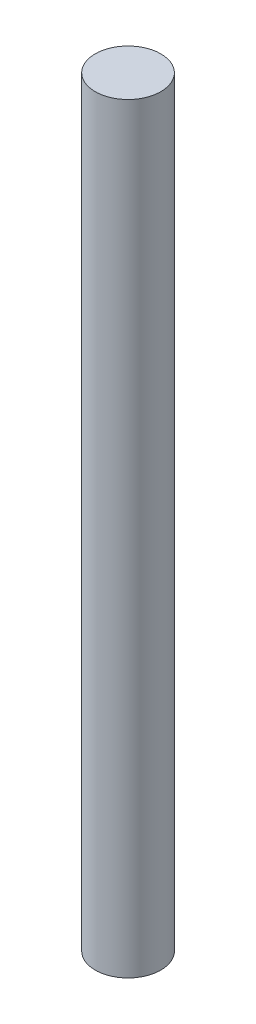
ISO-10303-21;
HEADER;
FILE_DESCRIPTION(('STEP AP214'),'2;1');
FILE_NAME('part.step','',(''),(''),'','','');
FILE_SCHEMA(('AUTOMOTIVE_DESIGN { 1 0 10303 214 1 1 1 1 }'));
ENDSEC;
DATA;
#1=APPLICATION_CONTEXT('core data for automotive mechanical design processes');
#2=APPLICATION_PROTOCOL_DEFINITION('international standard','automotive_design',2000,#1);
#3=PRODUCT_CONTEXT('',#1,'mechanical');
#4=PRODUCT('Part','Part','',(#3));
#5=PRODUCT_RELATED_PRODUCT_CATEGORY('part','',(#4));
#6=PRODUCT_DEFINITION_FORMATION('','',#4);
#7=PRODUCT_DEFINITION_CONTEXT('part definition',#1,'design');
#8=PRODUCT_DEFINITION('design','',#6,#7);
#9=PRODUCT_DEFINITION_SHAPE('','',#8);
#10=(LENGTH_UNIT() NAMED_UNIT(*) SI_UNIT(.MILLI.,.METRE.));
#11=(NAMED_UNIT(*) PLANE_ANGLE_UNIT() SI_UNIT($,.RADIAN.));
#12=(NAMED_UNIT(*) SI_UNIT($,.STERADIAN.) SOLID_ANGLE_UNIT());
#13=UNCERTAINTY_MEASURE_WITH_UNIT(LENGTH_MEASURE(1.E-05),#10,'distance_accuracy_value','');
#14=(GEOMETRIC_REPRESENTATION_CONTEXT(3) GLOBAL_UNCERTAINTY_ASSIGNED_CONTEXT((#13)) GLOBAL_UNIT_ASSIGNED_CONTEXT((#10,
#11,#12)) REPRESENTATION_CONTEXT('',''));
#15=CARTESIAN_POINT('',(0.,0.,0.));
#16=DIRECTION('',(0.,0.,1.));
#17=DIRECTION('',(1.,0.,0.));
#18=AXIS2_PLACEMENT_3D('',#15,#16,#17);
#19=CARTESIAN_POINT('',(0.,58.,0.));
#20=DIRECTION('',(0.,-1.,0.));
#21=DIRECTION('',(0.,0.,-1.));
#22=AXIS2_PLACEMENT_3D('',#19,#20,#21);
#23=CYLINDRICAL_SURFACE('',#22,2.5);
#24=CARTESIAN_POINT('',(0.,58.,0.));
#25=DIRECTION('',(0.,1.,0.));
#26=DIRECTION('',(0.,0.,1.));
#27=AXIS2_PLACEMENT_3D('',#24,#25,#26);
#28=CIRCLE('',#27,2.5);
#29=CARTESIAN_POINT('',(0.,58.,-2.5));
#30=VERTEX_POINT('',#29);
#31=EDGE_CURVE('E10',#30,#30,#28,.T.);
#32=CARTESIAN_POINT('',(0.,0.,0.));
#33=DIRECTION('',(0.,1.,0.));
#34=DIRECTION('',(0.,0.,1.));
#35=AXIS2_PLACEMENT_3D('',#32,#33,#34);
#36=CIRCLE('',#35,2.5);
#37=CARTESIAN_POINT('',(0.,0.,-2.5));
#38=VERTEX_POINT('',#37);
#39=EDGE_CURVE('E40',#38,#38,#36,.T.);
#40=CARTESIAN_POINT('',(0.,58.,-2.5));
#41=CARTESIAN_POINT('',(0.,57.3958333333333,-2.5));
#42=CARTESIAN_POINT('',(0.,56.7916666666667,-2.5));
#43=CARTESIAN_POINT('',(0.,55.5833333333333,-2.5));
#44=CARTESIAN_POINT('',(0.,54.9791666666667,-2.5));
#45=CARTESIAN_POINT('',(0.,53.7708333333333,-2.5));
#46=CARTESIAN_POINT('',(0.,53.1666666666667,-2.5));
#47=CARTESIAN_POINT('',(0.,51.9583333333333,-2.5));
#48=CARTESIAN_POINT('',(0.,51.3541666666667,-2.5));
#49=CARTESIAN_POINT('',(0.,50.1458333333333,-2.5));
#50=CARTESIAN_POINT('',(0.,49.5416666666667,-2.5));
#51=CARTESIAN_POINT('',(0.,48.3333333333333,-2.5));
#52=CARTESIAN_POINT('',(0.,47.7291666666667,-2.5));
#53=CARTESIAN_POINT('',(0.,46.5208333333333,-2.5));
#54=CARTESIAN_POINT('',(0.,45.9166666666667,-2.5));
#55=CARTESIAN_POINT('',(0.,44.7083333333333,-2.5));
#56=CARTESIAN_POINT('',(0.,44.1041666666667,-2.5));
#57=CARTESIAN_POINT('',(0.,42.8958333333333,-2.5));
#58=CARTESIAN_POINT('',(0.,42.2916666666667,-2.5));
#59=CARTESIAN_POINT('',(0.,41.0833333333333,-2.5));
#60=CARTESIAN_POINT('',(0.,40.4791666666667,-2.5));
#61=CARTESIAN_POINT('',(0.,39.2708333333333,-2.5));
#62=CARTESIAN_POINT('',(0.,38.6666666666667,-2.5));
#63=CARTESIAN_POINT('',(0.,37.4583333333333,-2.5));
#64=CARTESIAN_POINT('',(0.,36.8541666666667,-2.5));
#65=CARTESIAN_POINT('',(0.,35.6458333333333,-2.5));
#66=CARTESIAN_POINT('',(0.,35.0416666666667,-2.5));
#67=CARTESIAN_POINT('',(0.,33.8333333333333,-2.5));
#68=CARTESIAN_POINT('',(0.,33.2291666666667,-2.5));
#69=CARTESIAN_POINT('',(0.,32.0208333333333,-2.5));
#70=CARTESIAN_POINT('',(0.,31.4166666666667,-2.5));
#71=CARTESIAN_POINT('',(0.,30.2083333333333,-2.5));
#72=CARTESIAN_POINT('',(0.,29.6041666666667,-2.5));
#73=CARTESIAN_POINT('',(0.,28.3958333333333,-2.5));
#74=CARTESIAN_POINT('',(0.,27.7916666666667,-2.5));
#75=CARTESIAN_POINT('',(0.,26.5833333333333,-2.5));
#76=CARTESIAN_POINT('',(0.,25.9791666666667,-2.5));
#77=CARTESIAN_POINT('',(0.,24.7708333333333,-2.5));
#78=CARTESIAN_POINT('',(0.,24.1666666666667,-2.5));
#79=CARTESIAN_POINT('',(0.,22.9583333333333,-2.5));
#80=CARTESIAN_POINT('',(0.,22.3541666666667,-2.5));
#81=CARTESIAN_POINT('',(0.,21.1458333333333,-2.5));
#82=CARTESIAN_POINT('',(0.,20.5416666666667,-2.5));
#83=CARTESIAN_POINT('',(0.,19.3333333333333,-2.5));
#84=CARTESIAN_POINT('',(0.,18.7291666666667,-2.5));
#85=CARTESIAN_POINT('',(0.,17.5208333333333,-2.5));
#86=CARTESIAN_POINT('',(0.,16.9166666666667,-2.5));
#87=CARTESIAN_POINT('',(0.,15.7083333333333,-2.5));
#88=CARTESIAN_POINT('',(0.,15.1041666666667,-2.5));
#89=CARTESIAN_POINT('',(0.,13.8958333333333,-2.5));
#90=CARTESIAN_POINT('',(0.,13.2916666666667,-2.5));
#91=CARTESIAN_POINT('',(0.,12.0833333333333,-2.5));
#92=CARTESIAN_POINT('',(0.,11.4791666666667,-2.5));
#93=CARTESIAN_POINT('',(0.,10.2708333333333,-2.5));
#94=CARTESIAN_POINT('',(0.,9.66666666666667,-2.5));
#95=CARTESIAN_POINT('',(0.,8.45833333333333,-2.5));
#96=CARTESIAN_POINT('',(0.,7.85416666666667,-2.5));
#97=CARTESIAN_POINT('',(0.,6.64583333333333,-2.5));
#98=CARTESIAN_POINT('',(0.,6.04166666666667,-2.5));
#99=CARTESIAN_POINT('',(0.,4.83333333333333,-2.5));
#100=CARTESIAN_POINT('',(0.,4.22916666666667,-2.5));
#101=CARTESIAN_POINT('',(0.,3.02083333333334,-2.5));
#102=CARTESIAN_POINT('',(0.,2.41666666666667,-2.5));
#103=CARTESIAN_POINT('',(0.,1.20833333333333,-2.5));
#104=CARTESIAN_POINT('',(0.,0.604166666666666,-2.5));
#105=CARTESIAN_POINT('',(0.,0.,-2.5));
#106=B_SPLINE_CURVE_WITH_KNOTS('',3,(#40,#41,#42,#43,#44,#45,#46,#47,#48,#49,#50,#51,#52,#53,
#54,#55,#56,#57,#58,#59,#60,#61,#62,#63,#64,#65,#66,#67,#68,#69,#70,#71,#72,#73,#74,#75,#76,#77,
#78,#79,#80,#81,#82,#83,#84,#85,#86,#87,#88,#89,#90,#91,#92,#93,#94,#95,#96,#97,#98,#99,#100,
#101,#102,#103,#104,#105),.UNSPECIFIED.,.F.,.F.,(4,2,2,2,2,2,2,2,2,2,2,2,2,2,2,2,2,2,2,2,2,2,2,
2,2,2,2,2,2,2,2,2,4),(0.,1.81249999999999,3.625,5.4375,7.24999999999999,9.06249999999999,10.875,
12.6875,14.5,16.3125,18.125,19.9375,21.75,23.5625,25.375,27.1875,29.,30.8125,32.625,34.4375,
36.25,38.0625,39.875,41.6875,43.5,45.3125,47.125,48.9375,50.75,52.5625,54.375,56.1875,58.),.UNSPECIFIED.);
#107=EDGE_CURVE('BSEAM37',#30,#38,#106,.T.);
#108=ORIENTED_EDGE('',*,*,#31,.F.);
#109=ORIENTED_EDGE('',*,*,#39,.T.);
#110=ORIENTED_EDGE('',*,*,#107,.T.);
#111=ORIENTED_EDGE('',*,*,#107,.F.);
#112=EDGE_LOOP('',(#108,#110,#109,#111));
#113=FACE_BOUND('',#112,.T.);
#114=ADVANCED_FACE('F37',(#113),#23,.T.);
#115=CARTESIAN_POINT('',(0.,58.,0.));
#116=DIRECTION('',(0.,1.,0.));
#117=DIRECTION('',(0.,0.,1.));
#118=AXIS2_PLACEMENT_3D('',#115,#116,#117);
#119=PLANE('',#118);
#120=ORIENTED_EDGE('',*,*,#31,.T.);
#121=EDGE_LOOP('',(#120));
#122=FACE_BOUND('',#121,.T.);
#123=ADVANCED_FACE('F54',(#122),#119,.T.);
#124=CARTESIAN_POINT('',(0.,0.,0.));
#125=DIRECTION('',(0.,1.,0.));
#126=DIRECTION('',(0.,0.,1.));
#127=AXIS2_PLACEMENT_3D('',#124,#125,#126);
#128=PLANE('',#127);
#129=ORIENTED_EDGE('',*,*,#39,.F.);
#130=EDGE_LOOP('',(#129));
#131=FACE_BOUND('',#130,.T.);
#132=ADVANCED_FACE('F52',(#131),#128,.F.);
#133=CLOSED_SHELL('',(#114,#123,#132));
#134=MANIFOLD_SOLID_BREP('B2',#133);
#135=ADVANCED_BREP_SHAPE_REPRESENTATION('',(#18,#134),#14);
#136=SHAPE_DEFINITION_REPRESENTATION(#9,#135);
ENDSEC;
END-ISO-10303-21;
